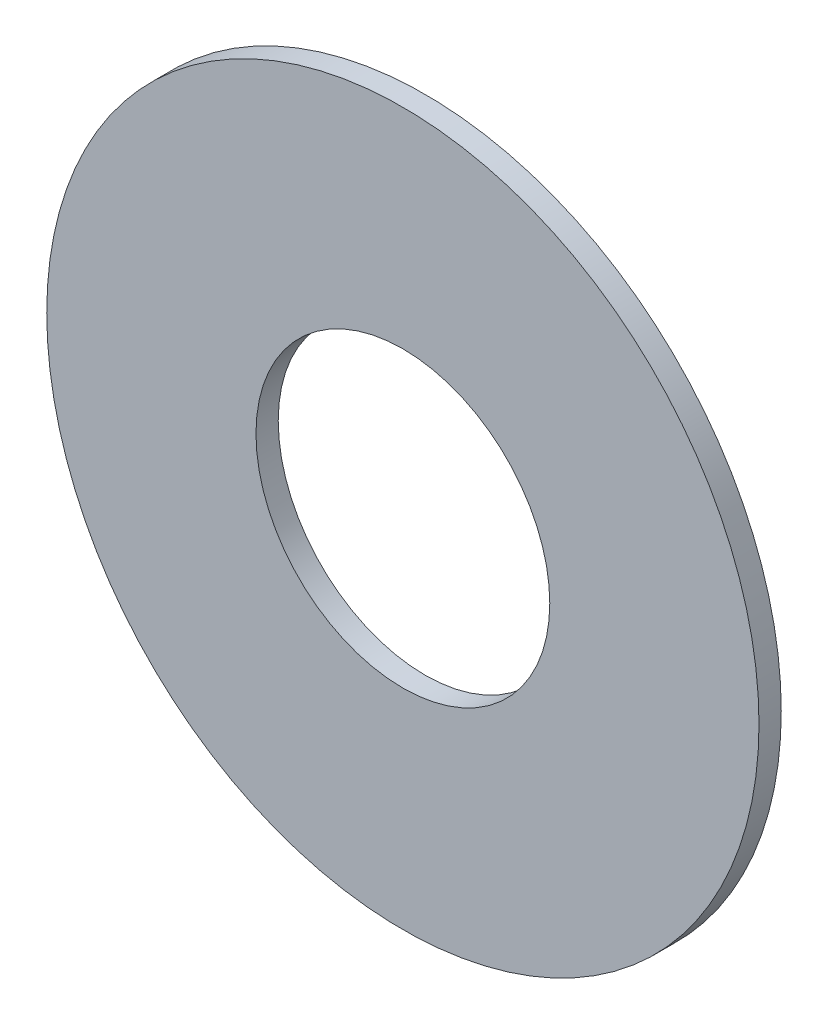
ISO-10303-21;
HEADER;
FILE_DESCRIPTION(('STEP AP214'),'2;1');
FILE_NAME('part.step','',(''),(''),'','','');
FILE_SCHEMA(('AUTOMOTIVE_DESIGN { 1 0 10303 214 1 1 1 1 }'));
ENDSEC;
DATA;
#1=APPLICATION_CONTEXT('core data for automotive mechanical design processes');
#2=APPLICATION_PROTOCOL_DEFINITION('international standard','automotive_design',2000,#1);
#3=PRODUCT_CONTEXT('',#1,'mechanical');
#4=PRODUCT('Part','Part','',(#3));
#5=PRODUCT_RELATED_PRODUCT_CATEGORY('part','',(#4));
#6=PRODUCT_DEFINITION_FORMATION('','',#4);
#7=PRODUCT_DEFINITION_CONTEXT('part definition',#1,'design');
#8=PRODUCT_DEFINITION('design','',#6,#7);
#9=PRODUCT_DEFINITION_SHAPE('','',#8);
#10=(LENGTH_UNIT() NAMED_UNIT(*) SI_UNIT(.MILLI.,.METRE.));
#11=(NAMED_UNIT(*) PLANE_ANGLE_UNIT() SI_UNIT($,.RADIAN.));
#12=(NAMED_UNIT(*) SI_UNIT($,.STERADIAN.) SOLID_ANGLE_UNIT());
#13=UNCERTAINTY_MEASURE_WITH_UNIT(LENGTH_MEASURE(1.E-05),#10,'distance_accuracy_value','');
#14=(GEOMETRIC_REPRESENTATION_CONTEXT(3) GLOBAL_UNCERTAINTY_ASSIGNED_CONTEXT((#13)) GLOBAL_UNIT_ASSIGNED_CONTEXT((#10,
#11,#12)) REPRESENTATION_CONTEXT('',''));
#15=CARTESIAN_POINT('',(0.,0.,0.));
#16=DIRECTION('',(0.,0.,1.));
#17=DIRECTION('',(1.,0.,0.));
#18=AXIS2_PLACEMENT_3D('',#15,#16,#17);
#19=CARTESIAN_POINT('',(-65.,0.,299.5));
#20=DIRECTION('',(0.,0.,1.));
#21=DIRECTION('',(1.,0.,0.));
#22=AXIS2_PLACEMENT_3D('',#19,#20,#21);
#23=CYLINDRICAL_SURFACE('',#22,3.3);
#24=DIRECTION('',(0.,0.,1.));
#25=VECTOR('',#24,1.);
#26=CARTESIAN_POINT('',(-61.7,0.,299.5));
#27=LINE('',#26,#25);
#28=CARTESIAN_POINT('',(-61.7,0.,299.5));
#29=VERTEX_POINT('',#28);
#30=CARTESIAN_POINT('',(-61.7,0.,300.));
#31=VERTEX_POINT('',#30);
#32=EDGE_CURVE('E10',#29,#31,#27,.T.);
#33=ORIENTED_EDGE('',*,*,#32,.F.);
#34=CARTESIAN_POINT('',(-65.,0.,299.5));
#35=DIRECTION('',(0.,0.,1.));
#36=DIRECTION('',(1.,0.,0.));
#37=AXIS2_PLACEMENT_3D('',#34,#35,#36);
#38=CIRCLE('',#37,3.3);
#39=EDGE_CURVE('E27',#29,#29,#38,.T.);
#40=ORIENTED_EDGE('',*,*,#39,.F.);
#41=ORIENTED_EDGE('',*,*,#32,.T.);
#42=CARTESIAN_POINT('',(-65.,0.,300.));
#43=DIRECTION('',(0.,0.,1.));
#44=DIRECTION('',(1.,0.,0.));
#45=AXIS2_PLACEMENT_3D('',#42,#43,#44);
#46=CIRCLE('',#45,3.3);
#47=EDGE_CURVE('E58',#31,#31,#46,.T.);
#48=ORIENTED_EDGE('',*,*,#47,.T.);
#49=EDGE_LOOP('',(#33,#40,#41,#48));
#50=FACE_BOUND('',#49,.T.);
#51=ADVANCED_FACE('F16',(#50),#23,.F.);
#52=CARTESIAN_POINT('',(-65.,0.,299.5));
#53=DIRECTION('',(0.,0.,1.));
#54=DIRECTION('',(1.,0.,0.));
#55=AXIS2_PLACEMENT_3D('',#52,#53,#54);
#56=PLANE('',#55);
#57=ORIENTED_EDGE('',*,*,#39,.T.);
#58=EDGE_LOOP('',(#57));
#59=FACE_BOUND('',#58,.T.);
#60=CARTESIAN_POINT('',(-65.,0.,299.5));
#61=DIRECTION('',(0.,0.,1.));
#62=DIRECTION('',(1.,0.,0.));
#63=AXIS2_PLACEMENT_3D('',#60,#61,#62);
#64=CIRCLE('',#63,8.);
#65=CARTESIAN_POINT('',(-57.,0.,299.5));
#66=VERTEX_POINT('',#65);
#67=EDGE_CURVE('E51',#66,#66,#64,.T.);
#68=ORIENTED_EDGE('',*,*,#67,.F.);
#69=EDGE_LOOP('',(#68));
#70=FACE_BOUND('',#69,.T.);
#71=ADVANCED_FACE('F18',(#59,#70),#56,.F.);
#72=CARTESIAN_POINT('',(-65.,0.,300.));
#73=DIRECTION('',(0.,0.,1.));
#74=DIRECTION('',(1.,0.,0.));
#75=AXIS2_PLACEMENT_3D('',#72,#73,#74);
#76=PLANE('',#75);
#77=ORIENTED_EDGE('',*,*,#47,.F.);
#78=EDGE_LOOP('',(#77));
#79=FACE_BOUND('',#78,.T.);
#80=CARTESIAN_POINT('',(-65.,0.,300.));
#81=DIRECTION('',(0.,0.,1.));
#82=DIRECTION('',(1.,0.,0.));
#83=AXIS2_PLACEMENT_3D('',#80,#81,#82);
#84=CIRCLE('',#83,8.);
#85=CARTESIAN_POINT('',(-57.,0.,300.));
#86=VERTEX_POINT('',#85);
#87=EDGE_CURVE('E20',#86,#86,#84,.T.);
#88=ORIENTED_EDGE('',*,*,#87,.T.);
#89=EDGE_LOOP('',(#88));
#90=FACE_BOUND('',#89,.T.);
#91=ADVANCED_FACE('F71',(#79,#90),#76,.T.);
#92=CARTESIAN_POINT('',(-65.,0.,299.5));
#93=DIRECTION('',(0.,0.,1.));
#94=DIRECTION('',(1.,0.,0.));
#95=AXIS2_PLACEMENT_3D('',#92,#93,#94);
#96=CYLINDRICAL_SURFACE('',#95,8.);
#97=ORIENTED_EDGE('',*,*,#87,.F.);
#98=DIRECTION('',(0.,0.,1.));
#99=VECTOR('',#98,1.);
#100=CARTESIAN_POINT('',(-57.,0.,299.5));
#101=LINE('',#100,#99);
#102=EDGE_CURVE('E54',#66,#86,#101,.T.);
#103=ORIENTED_EDGE('',*,*,#102,.F.);
#104=ORIENTED_EDGE('',*,*,#67,.T.);
#105=ORIENTED_EDGE('',*,*,#102,.T.);
#106=EDGE_LOOP('',(#97,#103,#104,#105));
#107=FACE_BOUND('',#106,.T.);
#108=ADVANCED_FACE('F53',(#107),#96,.T.);
#109=CLOSED_SHELL('',(#51,#71,#91,#108));
#110=MANIFOLD_SOLID_BREP('B1',#109);
#111=ADVANCED_BREP_SHAPE_REPRESENTATION('',(#18,#110),#14);
#112=SHAPE_DEFINITION_REPRESENTATION(#9,#111);
ENDSEC;
END-ISO-10303-21;
